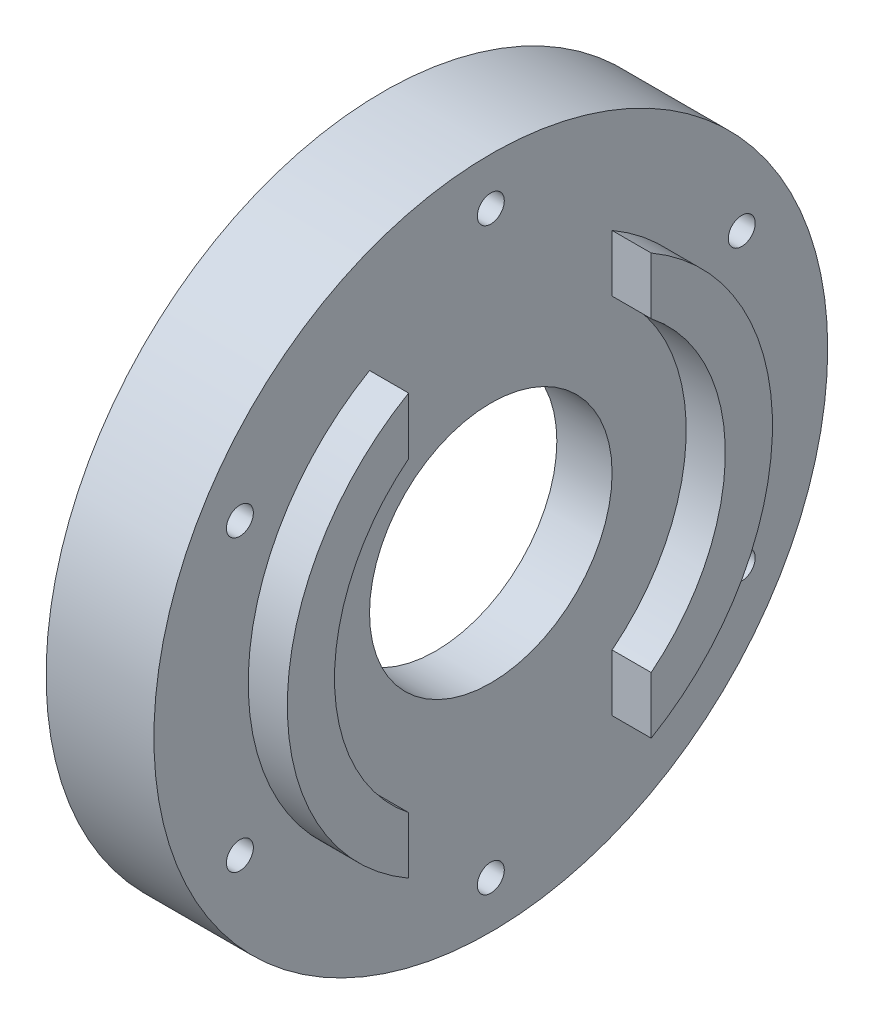
ISO-10303-21;
HEADER;
FILE_DESCRIPTION(('STEP AP214'),'2;1');
FILE_NAME('part.step','',(''),(''),'','','');
FILE_SCHEMA(('AUTOMOTIVE_DESIGN { 1 0 10303 214 1 1 1 1 }'));
ENDSEC;
DATA;
#1=APPLICATION_CONTEXT('core data for automotive mechanical design processes');
#2=APPLICATION_PROTOCOL_DEFINITION('international standard','automotive_design',2000,#1);
#3=PRODUCT_CONTEXT('',#1,'mechanical');
#4=PRODUCT('Part','Part','',(#3));
#5=PRODUCT_RELATED_PRODUCT_CATEGORY('part','',(#4));
#6=PRODUCT_DEFINITION_FORMATION('','',#4);
#7=PRODUCT_DEFINITION_CONTEXT('part definition',#1,'design');
#8=PRODUCT_DEFINITION('design','',#6,#7);
#9=PRODUCT_DEFINITION_SHAPE('','',#8);
#10=(LENGTH_UNIT() NAMED_UNIT(*) SI_UNIT(.MILLI.,.METRE.));
#11=(NAMED_UNIT(*) PLANE_ANGLE_UNIT() SI_UNIT($,.RADIAN.));
#12=(NAMED_UNIT(*) SI_UNIT($,.STERADIAN.) SOLID_ANGLE_UNIT());
#13=UNCERTAINTY_MEASURE_WITH_UNIT(LENGTH_MEASURE(1.E-05),#10,'distance_accuracy_value','');
#14=(GEOMETRIC_REPRESENTATION_CONTEXT(3) GLOBAL_UNCERTAINTY_ASSIGNED_CONTEXT((#13)) GLOBAL_UNIT_ASSIGNED_CONTEXT((#10,
#11,#12)) REPRESENTATION_CONTEXT('',''));
#15=CARTESIAN_POINT('',(0.,0.,0.));
#16=DIRECTION('',(0.,0.,1.));
#17=DIRECTION('',(1.,0.,0.));
#18=AXIS2_PLACEMENT_3D('',#15,#16,#17);
#19=CARTESIAN_POINT('',(-40.,0.,0.));
#20=DIRECTION('',(1.,0.,0.));
#21=DIRECTION('',(0.,0.,-1.));
#22=AXIS2_PLACEMENT_3D('',#19,#20,#21);
#23=CYLINDRICAL_SURFACE('',#22,45.);
#24=CARTESIAN_POINT('',(0.,0.,0.));
#25=DIRECTION('',(1.,0.,0.));
#26=DIRECTION('',(0.,0.,-1.));
#27=AXIS2_PLACEMENT_3D('',#24,#25,#26);
#28=CIRCLE('',#27,45.);
#29=CARTESIAN_POINT('',(0.,0.,-45.));
#30=VERTEX_POINT('',#29);
#31=EDGE_CURVE('E236',#30,#30,#28,.T.);
#32=ORIENTED_EDGE('',*,*,#31,.T.);
#33=EDGE_LOOP('',(#32));
#34=FACE_BOUND('',#33,.T.);
#35=CARTESIAN_POINT('',(-20.5,0.,0.));
#36=DIRECTION('',(-1.,0.,0.));
#37=DIRECTION('',(0.,0.,1.));
#38=AXIS2_PLACEMENT_3D('',#35,#36,#37);
#39=CIRCLE('',#38,45.);
#40=CARTESIAN_POINT('',(-20.5,0.,45.));
#41=VERTEX_POINT('',#40);
#42=EDGE_CURVE('E39',#41,#41,#39,.F.);
#43=ORIENTED_EDGE('',*,*,#42,.F.);
#44=EDGE_LOOP('',(#43));
#45=FACE_BOUND('',#44,.T.);
#46=ADVANCED_FACE('F35',(#34,#45),#23,.F.);
#47=CARTESIAN_POINT('',(14.5,0.,0.));
#48=DIRECTION('',(1.,0.,0.));
#49=DIRECTION('',(0.,0.,-1.));
#50=AXIS2_PLACEMENT_3D('',#47,#48,#49);
#51=PLANE('',#50);
#52=DIRECTION('',(0.,1.,0.));
#53=VECTOR('',#52,1.);
#54=CARTESIAN_POINT('',(14.5,-125.,-45.));
#55=LINE('',#54,#53);
#56=CARTESIAN_POINT('',(14.5,-77.9422863405995,-45.));
#57=VERTEX_POINT('',#56);
#58=CARTESIAN_POINT('',(14.5,-56.8440850045104,-45.));
#59=VERTEX_POINT('',#58);
#60=EDGE_CURVE('E171',#57,#59,#55,.T.);
#61=ORIENTED_EDGE('',*,*,#60,.F.);
#62=CARTESIAN_POINT('',(14.5,0.,0.));
#63=DIRECTION('',(1.,0.,0.));
#64=DIRECTION('',(0.,0.,-1.));
#65=AXIS2_PLACEMENT_3D('',#62,#63,#64);
#66=CIRCLE('',#65,90.);
#67=CARTESIAN_POINT('',(14.5,77.9422863405995,-45.));
#68=VERTEX_POINT('',#67);
#69=EDGE_CURVE('E194',#57,#68,#66,.T.);
#70=ORIENTED_EDGE('',*,*,#69,.T.);
#71=CARTESIAN_POINT('',(14.5,56.8440850045104,-45.));
#72=VERTEX_POINT('',#71);
#73=EDGE_CURVE('E172',#72,#68,#55,.T.);
#74=ORIENTED_EDGE('',*,*,#73,.F.);
#75=CARTESIAN_POINT('',(14.5,0.,0.));
#76=DIRECTION('',(1.,0.,0.));
#77=DIRECTION('',(0.,0.,-1.));
#78=AXIS2_PLACEMENT_3D('',#75,#76,#77);
#79=CIRCLE('',#78,72.5);
#80=EDGE_CURVE('E190',#59,#72,#79,.T.);
#81=ORIENTED_EDGE('',*,*,#80,.F.);
#82=EDGE_LOOP('',(#61,#70,#74,#81));
#83=FACE_BOUND('',#82,.T.);
#84=ADVANCED_FACE('F264',(#83),#51,.T.);
#85=CARTESIAN_POINT('',(14.5,0.,0.));
#86=DIRECTION('',(-1.,0.,0.));
#87=DIRECTION('',(0.,0.,1.));
#88=AXIS2_PLACEMENT_3D('',#85,#86,#87);
#89=CYLINDRICAL_SURFACE('',#88,90.);
#90=ORIENTED_EDGE('',*,*,#69,.F.);
#91=DIRECTION('',(-1.,0.,0.));
#92=VECTOR('',#91,1.);
#93=CARTESIAN_POINT('',(14.5,-77.9422863405995,-45.));
#94=LINE('',#93,#92);
#95=CARTESIAN_POINT('',(0.,-77.9422863405995,-45.));
#96=VERTEX_POINT('',#95);
#97=EDGE_CURVE('E187',#57,#96,#94,.T.);
#98=ORIENTED_EDGE('',*,*,#97,.T.);
#99=CARTESIAN_POINT('',(0.,0.,0.));
#100=DIRECTION('',(1.,0.,0.));
#101=DIRECTION('',(0.,0.,-1.));
#102=AXIS2_PLACEMENT_3D('',#99,#100,#101);
#103=CIRCLE('',#102,90.);
#104=CARTESIAN_POINT('',(0.,77.9422863405995,-45.));
#105=VERTEX_POINT('',#104);
#106=EDGE_CURVE('E199',#96,#105,#103,.T.);
#107=ORIENTED_EDGE('',*,*,#106,.T.);
#108=DIRECTION('',(-1.,0.,0.));
#109=VECTOR('',#108,1.);
#110=CARTESIAN_POINT('',(14.5,77.9422863405995,-45.));
#111=LINE('',#110,#109);
#112=EDGE_CURVE('E184',#105,#68,#111,.F.);
#113=ORIENTED_EDGE('',*,*,#112,.T.);
#114=EDGE_LOOP('',(#90,#98,#107,#113));
#115=FACE_BOUND('',#114,.T.);
#116=ADVANCED_FACE('F276',(#115),#89,.T.);
#117=CARTESIAN_POINT('',(14.5,0.,0.));
#118=DIRECTION('',(-1.,0.,0.));
#119=DIRECTION('',(0.,0.,1.));
#120=AXIS2_PLACEMENT_3D('',#117,#118,#119);
#121=CYLINDRICAL_SURFACE('',#120,72.5);
#122=DIRECTION('',(-1.,0.,0.));
#123=VECTOR('',#122,1.);
#124=CARTESIAN_POINT('',(14.5,-56.8440850045104,-45.));
#125=LINE('',#124,#123);
#126=CARTESIAN_POINT('',(0.,-56.8440850045104,-45.));
#127=VERTEX_POINT('',#126);
#128=EDGE_CURVE('E11',#59,#127,#125,.T.);
#129=ORIENTED_EDGE('',*,*,#128,.F.);
#130=ORIENTED_EDGE('',*,*,#80,.T.);
#131=DIRECTION('',(-1.,0.,0.));
#132=VECTOR('',#131,1.);
#133=CARTESIAN_POINT('',(14.5,56.8440850045104,-45.));
#134=LINE('',#133,#132);
#135=CARTESIAN_POINT('',(0.,56.8440850045104,-45.));
#136=VERTEX_POINT('',#135);
#137=EDGE_CURVE('E44',#136,#72,#134,.F.);
#138=ORIENTED_EDGE('',*,*,#137,.F.);
#139=CARTESIAN_POINT('',(0.,0.,0.));
#140=DIRECTION('',(1.,0.,0.));
#141=DIRECTION('',(0.,0.,-1.));
#142=AXIS2_PLACEMENT_3D('',#139,#140,#141);
#143=CIRCLE('',#142,72.5);
#144=EDGE_CURVE('E245',#136,#127,#143,.F.);
#145=ORIENTED_EDGE('',*,*,#144,.T.);
#146=EDGE_LOOP('',(#129,#130,#138,#145));
#147=FACE_BOUND('',#146,.T.);
#148=ADVANCED_FACE('F267',(#147),#121,.F.);
#149=CARTESIAN_POINT('',(-40.,0.,0.));
#150=DIRECTION('',(1.,0.,0.));
#151=DIRECTION('',(0.,0.,-1.));
#152=AXIS2_PLACEMENT_3D('',#149,#150,#151);
#153=CYLINDRICAL_SURFACE('',#152,125.);
#154=CARTESIAN_POINT('',(-40.,0.,0.));
#155=DIRECTION('',(1.,0.,0.));
#156=DIRECTION('',(0.,0.,-1.));
#157=AXIS2_PLACEMENT_3D('',#154,#155,#156);
#158=CIRCLE('',#157,125.);
#159=CARTESIAN_POINT('',(-40.,0.,-125.));
#160=VERTEX_POINT('',#159);
#161=EDGE_CURVE('E242',#160,#160,#158,.T.);
#162=ORIENTED_EDGE('',*,*,#161,.T.);
#163=EDGE_LOOP('',(#162));
#164=FACE_BOUND('',#163,.T.);
#165=CARTESIAN_POINT('',(0.,0.,0.));
#166=DIRECTION('',(1.,0.,0.));
#167=DIRECTION('',(0.,0.,-1.));
#168=AXIS2_PLACEMENT_3D('',#165,#166,#167);
#169=CIRCLE('',#168,125.);
#170=CARTESIAN_POINT('',(0.,0.,-125.));
#171=VERTEX_POINT('',#170);
#172=EDGE_CURVE('E241',#171,#171,#169,.T.);
#173=ORIENTED_EDGE('',*,*,#172,.F.);
#174=EDGE_LOOP('',(#173));
#175=FACE_BOUND('',#174,.T.);
#176=ADVANCED_FACE('F37',(#164,#175),#153,.T.);
#177=CARTESIAN_POINT('',(-40.,0.,0.));
#178=DIRECTION('',(1.,0.,0.));
#179=DIRECTION('',(0.,0.,-1.));
#180=AXIS2_PLACEMENT_3D('',#177,#178,#179);
#181=PLANE('',#180);
#182=CARTESIAN_POINT('',(-40.,0.,0.));
#183=DIRECTION('',(-1.,0.,0.));
#184=DIRECTION('',(0.,0.,1.));
#185=AXIS2_PLACEMENT_3D('',#182,#183,#184);
#186=CIRCLE('',#185,100.);
#187=CARTESIAN_POINT('',(-40.,0.,100.));
#188=VERTEX_POINT('',#187);
#189=EDGE_CURVE('E161',#188,#188,#186,.T.);
#190=ORIENTED_EDGE('',*,*,#189,.F.);
#191=EDGE_LOOP('',(#190));
#192=FACE_BOUND('',#191,.T.);
#193=CARTESIAN_POINT('',(-40.,-53.7499999999998,-93.0977309068273));
#194=DIRECTION('',(1.,0.,0.));
#195=DIRECTION('',(0.,0.,-1.));
#196=AXIS2_PLACEMENT_3D('',#193,#194,#195);
#197=CIRCLE('',#196,4.99999999999999);
#198=CARTESIAN_POINT('',(-40.,-53.7499999999998,-98.0977309068273));
#199=VERTEX_POINT('',#198);
#200=EDGE_CURVE('E202',#199,#199,#197,.T.);
#201=ORIENTED_EDGE('',*,*,#200,.T.);
#202=EDGE_LOOP('',(#201));
#203=FACE_BOUND('',#202,.T.);
#204=CARTESIAN_POINT('',(-40.,-107.5,0.));
#205=DIRECTION('',(1.,0.,0.));
#206=DIRECTION('',(0.,0.,1.));
#207=AXIS2_PLACEMENT_3D('',#204,#205,#206);
#208=CIRCLE('',#207,5.00000000000001);
#209=CARTESIAN_POINT('',(-40.,-107.5,4.99999999999998));
#210=VERTEX_POINT('',#209);
#211=EDGE_CURVE('E209',#210,#210,#208,.T.);
#212=ORIENTED_EDGE('',*,*,#211,.T.);
#213=EDGE_LOOP('',(#212));
#214=FACE_BOUND('',#213,.T.);
#215=CARTESIAN_POINT('',(-40.,-53.7500000000011,93.0977309068265));
#216=DIRECTION('',(1.,0.,0.));
#217=DIRECTION('',(0.,0.,-1.));
#218=AXIS2_PLACEMENT_3D('',#215,#216,#217);
#219=CIRCLE('',#218,4.99999999999999);
#220=CARTESIAN_POINT('',(-40.,-53.7500000000011,88.0977309068265));
#221=VERTEX_POINT('',#220);
#222=EDGE_CURVE('E215',#221,#221,#219,.T.);
#223=ORIENTED_EDGE('',*,*,#222,.T.);
#224=EDGE_LOOP('',(#223));
#225=FACE_BOUND('',#224,.T.);
#226=CARTESIAN_POINT('',(-40.,53.7500000000011,93.0977309068265));
#227=DIRECTION('',(1.,0.,0.));
#228=DIRECTION('',(0.,0.,1.));
#229=AXIS2_PLACEMENT_3D('',#226,#227,#228);
#230=CIRCLE('',#229,4.99999999999999);
#231=CARTESIAN_POINT('',(-40.,53.7500000000011,98.0977309068265));
#232=VERTEX_POINT('',#231);
#233=EDGE_CURVE('E221',#232,#232,#230,.T.);
#234=ORIENTED_EDGE('',*,*,#233,.T.);
#235=EDGE_LOOP('',(#234));
#236=FACE_BOUND('',#235,.T.);
#237=CARTESIAN_POINT('',(-40.,53.7499999999998,-93.0977309068273));
#238=DIRECTION('',(1.,0.,0.));
#239=DIRECTION('',(0.,0.,1.));
#240=AXIS2_PLACEMENT_3D('',#237,#238,#239);
#241=CIRCLE('',#240,5.00000000000001);
#242=CARTESIAN_POINT('',(-40.,53.7499999999998,-88.0977309068273));
#243=VERTEX_POINT('',#242);
#244=EDGE_CURVE('E227',#243,#243,#241,.T.);
#245=ORIENTED_EDGE('',*,*,#244,.T.);
#246=EDGE_LOOP('',(#245));
#247=FACE_BOUND('',#246,.T.);
#248=CARTESIAN_POINT('',(-40.,107.5,0.));
#249=DIRECTION('',(1.,0.,0.));
#250=DIRECTION('',(0.,0.,-1.));
#251=AXIS2_PLACEMENT_3D('',#248,#249,#250);
#252=CIRCLE('',#251,5.00000000000001);
#253=CARTESIAN_POINT('',(-40.,107.5,-5.00000000000001));
#254=VERTEX_POINT('',#253);
#255=EDGE_CURVE('E233',#254,#254,#252,.T.);
#256=ORIENTED_EDGE('',*,*,#255,.T.);
#257=EDGE_LOOP('',(#256));
#258=FACE_BOUND('',#257,.T.);
#259=ORIENTED_EDGE('',*,*,#161,.F.);
#260=EDGE_LOOP('',(#259));
#261=FACE_BOUND('',#260,.T.);
#262=ADVANCED_FACE('F301',(#192,#203,#214,#225,#236,#247,#258,#261),#181,.F.);
#263=CARTESIAN_POINT('',(0.,0.,0.));
#264=DIRECTION('',(1.,0.,0.));
#265=DIRECTION('',(0.,0.,-1.));
#266=AXIS2_PLACEMENT_3D('',#263,#264,#265);
#267=PLANE('',#266);
#268=ORIENTED_EDGE('',*,*,#31,.F.);
#269=EDGE_LOOP('',(#268));
#270=FACE_BOUND('',#269,.T.);
#271=DIRECTION('',(0.,1.,0.));
#272=VECTOR('',#271,1.);
#273=CARTESIAN_POINT('',(0.,-125.,-45.));
#274=LINE('',#273,#272);
#275=EDGE_CURVE('E170',#96,#127,#274,.T.);
#276=ORIENTED_EDGE('',*,*,#275,.T.);
#277=ORIENTED_EDGE('',*,*,#144,.F.);
#278=EDGE_CURVE('E167',#136,#105,#274,.T.);
#279=ORIENTED_EDGE('',*,*,#278,.T.);
#280=ORIENTED_EDGE('',*,*,#106,.F.);
#281=EDGE_LOOP('',(#276,#277,#279,#280));
#282=FACE_BOUND('',#281,.T.);
#283=DIRECTION('',(0.,1.,0.));
#284=VECTOR('',#283,1.);
#285=CARTESIAN_POINT('',(0.,-125.,45.));
#286=LINE('',#285,#284);
#287=CARTESIAN_POINT('',(0.,56.8440850045104,45.));
#288=VERTEX_POINT('',#287);
#289=CARTESIAN_POINT('',(0.,77.9422863405995,45.));
#290=VERTEX_POINT('',#289);
#291=EDGE_CURVE('E176',#288,#290,#286,.T.);
#292=ORIENTED_EDGE('',*,*,#291,.F.);
#293=CARTESIAN_POINT('',(0.,-56.8440850045104,45.));
#294=VERTEX_POINT('',#293);
#295=EDGE_CURVE('E250',#294,#288,#143,.F.);
#296=ORIENTED_EDGE('',*,*,#295,.F.);
#297=CARTESIAN_POINT('',(0.,-77.9422863405995,45.));
#298=VERTEX_POINT('',#297);
#299=EDGE_CURVE('E51',#298,#294,#286,.T.);
#300=ORIENTED_EDGE('',*,*,#299,.F.);
#301=EDGE_CURVE('E198',#290,#298,#103,.T.);
#302=ORIENTED_EDGE('',*,*,#301,.F.);
#303=EDGE_LOOP('',(#292,#296,#300,#302));
#304=FACE_BOUND('',#303,.T.);
#305=ORIENTED_EDGE('',*,*,#172,.T.);
#306=EDGE_LOOP('',(#305));
#307=FACE_BOUND('',#306,.T.);
#308=CARTESIAN_POINT('',(0.,-53.7500000000011,93.0977309068265));
#309=DIRECTION('',(1.,0.,0.));
#310=DIRECTION('',(0.,0.,-1.));
#311=AXIS2_PLACEMENT_3D('',#308,#309,#310);
#312=CIRCLE('',#311,4.99999999999999);
#313=CARTESIAN_POINT('',(0.,-53.7500000000011,88.0977309068265));
#314=VERTEX_POINT('',#313);
#315=EDGE_CURVE('E212',#314,#314,#312,.T.);
#316=ORIENTED_EDGE('',*,*,#315,.F.);
#317=EDGE_LOOP('',(#316));
#318=FACE_BOUND('',#317,.T.);
#319=CARTESIAN_POINT('',(0.,53.7500000000011,93.0977309068265));
#320=DIRECTION('',(1.,0.,0.));
#321=DIRECTION('',(0.,0.,1.));
#322=AXIS2_PLACEMENT_3D('',#319,#320,#321);
#323=CIRCLE('',#322,4.99999999999999);
#324=CARTESIAN_POINT('',(0.,53.7500000000011,98.0977309068265));
#325=VERTEX_POINT('',#324);
#326=EDGE_CURVE('E218',#325,#325,#323,.T.);
#327=ORIENTED_EDGE('',*,*,#326,.F.);
#328=EDGE_LOOP('',(#327));
#329=FACE_BOUND('',#328,.T.);
#330=CARTESIAN_POINT('',(0.,-107.5,0.));
#331=DIRECTION('',(1.,0.,0.));
#332=DIRECTION('',(0.,0.,1.));
#333=AXIS2_PLACEMENT_3D('',#330,#331,#332);
#334=CIRCLE('',#333,5.00000000000001);
#335=CARTESIAN_POINT('',(0.,-107.5,4.99999999999998));
#336=VERTEX_POINT('',#335);
#337=EDGE_CURVE('E205',#336,#336,#334,.T.);
#338=ORIENTED_EDGE('',*,*,#337,.F.);
#339=EDGE_LOOP('',(#338));
#340=FACE_BOUND('',#339,.T.);
#341=CARTESIAN_POINT('',(0.,107.5,0.));
#342=DIRECTION('',(1.,0.,0.));
#343=DIRECTION('',(0.,0.,-1.));
#344=AXIS2_PLACEMENT_3D('',#341,#342,#343);
#345=CIRCLE('',#344,5.00000000000001);
#346=CARTESIAN_POINT('',(0.,107.5,-5.00000000000001));
#347=VERTEX_POINT('',#346);
#348=EDGE_CURVE('E230',#347,#347,#345,.T.);
#349=ORIENTED_EDGE('',*,*,#348,.F.);
#350=EDGE_LOOP('',(#349));
#351=FACE_BOUND('',#350,.T.);
#352=CARTESIAN_POINT('',(0.,53.7499999999998,-93.0977309068273));
#353=DIRECTION('',(1.,0.,0.));
#354=DIRECTION('',(0.,0.,1.));
#355=AXIS2_PLACEMENT_3D('',#352,#353,#354);
#356=CIRCLE('',#355,5.00000000000001);
#357=CARTESIAN_POINT('',(0.,53.7499999999998,-88.0977309068273));
#358=VERTEX_POINT('',#357);
#359=EDGE_CURVE('E224',#358,#358,#356,.T.);
#360=ORIENTED_EDGE('',*,*,#359,.F.);
#361=EDGE_LOOP('',(#360));
#362=FACE_BOUND('',#361,.T.);
#363=CARTESIAN_POINT('',(0.,-53.7499999999998,-93.0977309068273));
#364=DIRECTION('',(1.,0.,0.));
#365=DIRECTION('',(0.,0.,-1.));
#366=AXIS2_PLACEMENT_3D('',#363,#364,#365);
#367=CIRCLE('',#366,4.99999999999999);
#368=CARTESIAN_POINT('',(0.,-53.7499999999998,-98.0977309068273));
#369=VERTEX_POINT('',#368);
#370=EDGE_CURVE('E206',#369,#369,#367,.T.);
#371=ORIENTED_EDGE('',*,*,#370,.F.);
#372=EDGE_LOOP('',(#371));
#373=FACE_BOUND('',#372,.T.);
#374=ADVANCED_FACE('F273',(#270,#282,#304,#307,#318,#329,#340,#351,#362,#373),#267,.T.);
#375=CARTESIAN_POINT('',(-40.,107.5,0.));
#376=DIRECTION('',(1.,0.,0.));
#377=DIRECTION('',(0.,0.,-1.));
#378=AXIS2_PLACEMENT_3D('',#375,#376,#377);
#379=CYLINDRICAL_SURFACE('',#378,5.00000000000001);
#380=ORIENTED_EDGE('',*,*,#255,.F.);
#381=EDGE_LOOP('',(#380));
#382=FACE_BOUND('',#381,.T.);
#383=ORIENTED_EDGE('',*,*,#348,.T.);
#384=EDGE_LOOP('',(#383));
#385=FACE_BOUND('',#384,.T.);
#386=ADVANCED_FACE('F299',(#382,#385),#379,.F.);
#387=CARTESIAN_POINT('',(-40.,53.7499999999998,-93.0977309068273));
#388=DIRECTION('',(1.,0.,0.));
#389=DIRECTION('',(0.,0.,-1.));
#390=AXIS2_PLACEMENT_3D('',#387,#388,#389);
#391=CYLINDRICAL_SURFACE('',#390,5.00000000000001);
#392=ORIENTED_EDGE('',*,*,#244,.F.);
#393=EDGE_LOOP('',(#392));
#394=FACE_BOUND('',#393,.T.);
#395=ORIENTED_EDGE('',*,*,#359,.T.);
#396=EDGE_LOOP('',(#395));
#397=FACE_BOUND('',#396,.T.);
#398=ADVANCED_FACE('F309',(#394,#397),#391,.F.);
#399=CARTESIAN_POINT('',(-40.,53.7500000000011,93.0977309068265));
#400=DIRECTION('',(1.,0.,0.));
#401=DIRECTION('',(0.,0.,-1.));
#402=AXIS2_PLACEMENT_3D('',#399,#400,#401);
#403=CYLINDRICAL_SURFACE('',#402,4.99999999999999);
#404=ORIENTED_EDGE('',*,*,#233,.F.);
#405=EDGE_LOOP('',(#404));
#406=FACE_BOUND('',#405,.T.);
#407=ORIENTED_EDGE('',*,*,#326,.T.);
#408=EDGE_LOOP('',(#407));
#409=FACE_BOUND('',#408,.T.);
#410=ADVANCED_FACE('F315',(#406,#409),#403,.F.);
#411=CARTESIAN_POINT('',(-40.,-53.7500000000011,93.0977309068265));
#412=DIRECTION('',(1.,0.,0.));
#413=DIRECTION('',(0.,0.,-1.));
#414=AXIS2_PLACEMENT_3D('',#411,#412,#413);
#415=CYLINDRICAL_SURFACE('',#414,4.99999999999999);
#416=ORIENTED_EDGE('',*,*,#222,.F.);
#417=EDGE_LOOP('',(#416));
#418=FACE_BOUND('',#417,.T.);
#419=ORIENTED_EDGE('',*,*,#315,.T.);
#420=EDGE_LOOP('',(#419));
#421=FACE_BOUND('',#420,.T.);
#422=ADVANCED_FACE('F335',(#418,#421),#415,.F.);
#423=CARTESIAN_POINT('',(-40.,-107.5,0.));
#424=DIRECTION('',(1.,0.,0.));
#425=DIRECTION('',(0.,0.,-1.));
#426=AXIS2_PLACEMENT_3D('',#423,#424,#425);
#427=CYLINDRICAL_SURFACE('',#426,5.00000000000001);
#428=ORIENTED_EDGE('',*,*,#211,.F.);
#429=EDGE_LOOP('',(#428));
#430=FACE_BOUND('',#429,.T.);
#431=ORIENTED_EDGE('',*,*,#337,.T.);
#432=EDGE_LOOP('',(#431));
#433=FACE_BOUND('',#432,.T.);
#434=ADVANCED_FACE('F328',(#430,#433),#427,.F.);
#435=CARTESIAN_POINT('',(-40.,-53.7499999999998,-93.0977309068273));
#436=DIRECTION('',(1.,0.,0.));
#437=DIRECTION('',(0.,0.,-1.));
#438=AXIS2_PLACEMENT_3D('',#435,#436,#437);
#439=CYLINDRICAL_SURFACE('',#438,4.99999999999999);
#440=ORIENTED_EDGE('',*,*,#200,.F.);
#441=EDGE_LOOP('',(#440));
#442=FACE_BOUND('',#441,.T.);
#443=ORIENTED_EDGE('',*,*,#370,.T.);
#444=EDGE_LOOP('',(#443));
#445=FACE_BOUND('',#444,.T.);
#446=ADVANCED_FACE('F326',(#442,#445),#439,.F.);
#447=DIRECTION('',(0.,1.,0.));
#448=VECTOR('',#447,1.);
#449=CARTESIAN_POINT('',(14.5,-125.,45.));
#450=LINE('',#449,#448);
#451=CARTESIAN_POINT('',(14.5,56.8440850045104,45.));
#452=VERTEX_POINT('',#451);
#453=CARTESIAN_POINT('',(14.5,77.9422863405995,45.));
#454=VERTEX_POINT('',#453);
#455=EDGE_CURVE('E59',#452,#454,#450,.T.);
#456=ORIENTED_EDGE('',*,*,#455,.T.);
#457=CARTESIAN_POINT('',(14.5,-77.9422863405995,45.));
#458=VERTEX_POINT('',#457);
#459=EDGE_CURVE('E197',#454,#458,#66,.T.);
#460=ORIENTED_EDGE('',*,*,#459,.T.);
#461=CARTESIAN_POINT('',(14.5,-56.8440850045104,45.));
#462=VERTEX_POINT('',#461);
#463=EDGE_CURVE('E174',#458,#462,#450,.T.);
#464=ORIENTED_EDGE('',*,*,#463,.T.);
#465=EDGE_CURVE('E193',#452,#462,#79,.T.);
#466=ORIENTED_EDGE('',*,*,#465,.F.);
#467=EDGE_LOOP('',(#456,#460,#464,#466));
#468=FACE_BOUND('',#467,.T.);
#469=ADVANCED_FACE('F287',(#468),#51,.T.);
#470=ORIENTED_EDGE('',*,*,#459,.F.);
#471=DIRECTION('',(-1.,0.,0.));
#472=VECTOR('',#471,1.);
#473=CARTESIAN_POINT('',(14.5,77.9422863405995,45.));
#474=LINE('',#473,#472);
#475=EDGE_CURVE('E181',#454,#290,#474,.T.);
#476=ORIENTED_EDGE('',*,*,#475,.T.);
#477=ORIENTED_EDGE('',*,*,#301,.T.);
#478=DIRECTION('',(-1.,0.,0.));
#479=VECTOR('',#478,1.);
#480=CARTESIAN_POINT('',(14.5,-77.9422863405995,45.));
#481=LINE('',#480,#479);
#482=EDGE_CURVE('E178',#298,#458,#481,.F.);
#483=ORIENTED_EDGE('',*,*,#482,.T.);
#484=EDGE_LOOP('',(#470,#476,#477,#483));
#485=FACE_BOUND('',#484,.T.);
#486=ADVANCED_FACE('F279',(#485),#89,.T.);
#487=DIRECTION('',(-1.,0.,0.));
#488=VECTOR('',#487,1.);
#489=CARTESIAN_POINT('',(14.5,56.8440850045104,45.));
#490=LINE('',#489,#488);
#491=EDGE_CURVE('E253',#452,#288,#490,.T.);
#492=ORIENTED_EDGE('',*,*,#491,.F.);
#493=ORIENTED_EDGE('',*,*,#465,.T.);
#494=DIRECTION('',(-1.,0.,0.));
#495=VECTOR('',#494,1.);
#496=CARTESIAN_POINT('',(14.5,-56.8440850045104,45.));
#497=LINE('',#496,#495);
#498=EDGE_CURVE('E251',#294,#462,#497,.F.);
#499=ORIENTED_EDGE('',*,*,#498,.F.);
#500=ORIENTED_EDGE('',*,*,#295,.T.);
#501=EDGE_LOOP('',(#492,#493,#499,#500));
#502=FACE_BOUND('',#501,.T.);
#503=ADVANCED_FACE('F285',(#502),#121,.F.);
#504=CARTESIAN_POINT('',(0.,-125.,45.));
#505=DIRECTION('',(0.,0.,1.));
#506=DIRECTION('',(1.,0.,0.));
#507=AXIS2_PLACEMENT_3D('',#504,#505,#506);
#508=PLANE('',#507);
#509=ORIENTED_EDGE('',*,*,#299,.T.);
#510=ORIENTED_EDGE('',*,*,#498,.T.);
#511=ORIENTED_EDGE('',*,*,#463,.F.);
#512=ORIENTED_EDGE('',*,*,#482,.F.);
#513=EDGE_LOOP('',(#509,#510,#511,#512));
#514=FACE_BOUND('',#513,.T.);
#515=ADVANCED_FACE('F523',(#514),#508,.F.);
#516=CARTESIAN_POINT('',(0.,-125.,-45.));
#517=DIRECTION('',(0.,0.,-1.));
#518=DIRECTION('',(-1.,0.,0.));
#519=AXIS2_PLACEMENT_3D('',#516,#517,#518);
#520=PLANE('',#519);
#521=ORIENTED_EDGE('',*,*,#60,.T.);
#522=ORIENTED_EDGE('',*,*,#128,.T.);
#523=ORIENTED_EDGE('',*,*,#275,.F.);
#524=ORIENTED_EDGE('',*,*,#97,.F.);
#525=EDGE_LOOP('',(#521,#522,#523,#524));
#526=FACE_BOUND('',#525,.T.);
#527=ADVANCED_FACE('F270',(#526),#520,.F.);
#528=ORIENTED_EDGE('',*,*,#278,.F.);
#529=ORIENTED_EDGE('',*,*,#137,.T.);
#530=ORIENTED_EDGE('',*,*,#73,.T.);
#531=ORIENTED_EDGE('',*,*,#112,.F.);
#532=EDGE_LOOP('',(#528,#529,#530,#531));
#533=FACE_BOUND('',#532,.T.);
#534=ADVANCED_FACE('F258',(#533),#520,.F.);
#535=ORIENTED_EDGE('',*,*,#455,.F.);
#536=ORIENTED_EDGE('',*,*,#491,.T.);
#537=ORIENTED_EDGE('',*,*,#291,.T.);
#538=ORIENTED_EDGE('',*,*,#475,.F.);
#539=EDGE_LOOP('',(#535,#536,#537,#538));
#540=FACE_BOUND('',#539,.T.);
#541=ADVANCED_FACE('F403',(#540),#508,.F.);
#542=CARTESIAN_POINT('',(-20.5,0.,0.));
#543=DIRECTION('',(-1.,0.,0.));
#544=DIRECTION('',(0.,0.,1.));
#545=AXIS2_PLACEMENT_3D('',#542,#543,#544);
#546=PLANE('',#545);
#547=CARTESIAN_POINT('',(-20.5,90.,0.));
#548=DIRECTION('',(-1.,0.,0.));
#549=DIRECTION('',(0.,0.,1.));
#550=AXIS2_PLACEMENT_3D('',#547,#548,#549);
#551=CIRCLE('',#550,4.);
#552=CARTESIAN_POINT('',(-20.5,90.,4.));
#553=VERTEX_POINT('',#552);
#554=EDGE_CURVE('E127',#553,#553,#551,.T.);
#555=ORIENTED_EDGE('',*,*,#554,.F.);
#556=EDGE_LOOP('',(#555));
#557=FACE_BOUND('',#556,.T.);
#558=CARTESIAN_POINT('',(-20.5,44.9999999999998,77.9422863405996));
#559=DIRECTION('',(-1.,0.,0.));
#560=DIRECTION('',(0.,0.,1.));
#561=AXIS2_PLACEMENT_3D('',#558,#559,#560);
#562=CIRCLE('',#561,4.);
#563=CARTESIAN_POINT('',(-20.5,44.9999999999998,81.9422863405996));
#564=VERTEX_POINT('',#563);
#565=EDGE_CURVE('E126',#564,#564,#562,.T.);
#566=ORIENTED_EDGE('',*,*,#565,.F.);
#567=EDGE_LOOP('',(#566));
#568=FACE_BOUND('',#567,.T.);
#569=CARTESIAN_POINT('',(-20.5,-44.9999999999998,77.9422863405996));
#570=DIRECTION('',(-1.,0.,0.));
#571=DIRECTION('',(0.,0.,1.));
#572=AXIS2_PLACEMENT_3D('',#569,#570,#571);
#573=CIRCLE('',#572,4.);
#574=CARTESIAN_POINT('',(-20.5,-44.9999999999998,81.9422863405996));
#575=VERTEX_POINT('',#574);
#576=EDGE_CURVE('E137',#575,#575,#573,.T.);
#577=ORIENTED_EDGE('',*,*,#576,.F.);
#578=EDGE_LOOP('',(#577));
#579=FACE_BOUND('',#578,.T.);
#580=CARTESIAN_POINT('',(-20.5,-90.,0.));
#581=DIRECTION('',(-1.,0.,0.));
#582=DIRECTION('',(0.,0.,1.));
#583=AXIS2_PLACEMENT_3D('',#580,#581,#582);
#584=CIRCLE('',#583,4.);
#585=CARTESIAN_POINT('',(-20.5,-90.,4.));
#586=VERTEX_POINT('',#585);
#587=EDGE_CURVE('E143',#586,#586,#584,.T.);
#588=ORIENTED_EDGE('',*,*,#587,.F.);
#589=EDGE_LOOP('',(#588));
#590=FACE_BOUND('',#589,.T.);
#591=CARTESIAN_POINT('',(-20.5,-44.9999999999998,-77.9422863405996));
#592=DIRECTION('',(-1.,0.,0.));
#593=DIRECTION('',(0.,0.,1.));
#594=AXIS2_PLACEMENT_3D('',#591,#592,#593);
#595=CIRCLE('',#594,4.);
#596=CARTESIAN_POINT('',(-20.5,-44.9999999999998,-73.9422863405996));
#597=VERTEX_POINT('',#596);
#598=EDGE_CURVE('E149',#597,#597,#595,.T.);
#599=ORIENTED_EDGE('',*,*,#598,.F.);
#600=EDGE_LOOP('',(#599));
#601=FACE_BOUND('',#600,.T.);
#602=CARTESIAN_POINT('',(-20.5,44.9999999999998,-77.9422863405996));
#603=DIRECTION('',(-1.,0.,0.));
#604=DIRECTION('',(0.,0.,1.));
#605=AXIS2_PLACEMENT_3D('',#602,#603,#604);
#606=CIRCLE('',#605,4.);
#607=CARTESIAN_POINT('',(-20.5,44.9999999999998,-73.9422863405996));
#608=VERTEX_POINT('',#607);
#609=EDGE_CURVE('E155',#608,#608,#606,.T.);
#610=ORIENTED_EDGE('',*,*,#609,.F.);
#611=EDGE_LOOP('',(#610));
#612=FACE_BOUND('',#611,.T.);
#613=CARTESIAN_POINT('',(-20.5,0.,0.));
#614=DIRECTION('',(-1.,0.,0.));
#615=DIRECTION('',(0.,0.,1.));
#616=AXIS2_PLACEMENT_3D('',#613,#614,#615);
#617=CIRCLE('',#616,100.);
#618=CARTESIAN_POINT('',(-20.5,0.,100.));
#619=VERTEX_POINT('',#618);
#620=EDGE_CURVE('E162',#619,#619,#617,.T.);
#621=ORIENTED_EDGE('',*,*,#620,.T.);
#622=EDGE_LOOP('',(#621));
#623=FACE_BOUND('',#622,.T.);
#624=ORIENTED_EDGE('',*,*,#42,.T.);
#625=EDGE_LOOP('',(#624));
#626=FACE_BOUND('',#625,.T.);
#627=ADVANCED_FACE('F391',(#557,#568,#579,#590,#601,#612,#623,#626),#546,.T.);
#628=CARTESIAN_POINT('',(-20.5,0.,0.));
#629=DIRECTION('',(-1.,0.,0.));
#630=DIRECTION('',(0.,0.,1.));
#631=AXIS2_PLACEMENT_3D('',#628,#629,#630);
#632=CYLINDRICAL_SURFACE('',#631,100.);
#633=ORIENTED_EDGE('',*,*,#620,.F.);
#634=EDGE_LOOP('',(#633));
#635=FACE_BOUND('',#634,.T.);
#636=ORIENTED_EDGE('',*,*,#189,.T.);
#637=EDGE_LOOP('',(#636));
#638=FACE_BOUND('',#637,.T.);
#639=ADVANCED_FACE('F385',(#635,#638),#632,.F.);
#640=CARTESIAN_POINT('',(-10.5,44.9999999999998,-77.9422863405996));
#641=DIRECTION('',(-1.,0.,0.));
#642=DIRECTION('',(0.,0.,1.));
#643=AXIS2_PLACEMENT_3D('',#640,#641,#642);
#644=CONICAL_SURFACE('',#643,4.,1.02974425867665);
#645=CARTESIAN_POINT('',(-8.09655752388976,44.9999999999998,-77.9422863405996));
#646=VERTEX_POINT('',#645);
#647=VERTEX_LOOP('',#646);
#648=FACE_BOUND('',#647,.T.);
#649=CARTESIAN_POINT('',(-10.5,44.9999999999998,-77.9422863405996));
#650=DIRECTION('',(-1.,0.,0.));
#651=DIRECTION('',(0.,0.,1.));
#652=AXIS2_PLACEMENT_3D('',#649,#650,#651);
#653=CIRCLE('',#652,4.);
#654=CARTESIAN_POINT('',(-10.5,44.9999999999998,-73.9422863405996));
#655=VERTEX_POINT('',#654);
#656=EDGE_CURVE('E158',#655,#655,#653,.T.);
#657=ORIENTED_EDGE('',*,*,#656,.T.);
#658=EDGE_LOOP('',(#657));
#659=FACE_BOUND('',#658,.T.);
#660=ADVANCED_FACE('F390',(#648,#659),#644,.F.);
#661=CARTESIAN_POINT('',(-20.5,44.9999999999998,-77.9422863405996));
#662=DIRECTION('',(-1.,0.,0.));
#663=DIRECTION('',(0.,0.,1.));
#664=AXIS2_PLACEMENT_3D('',#661,#662,#663);
#665=CYLINDRICAL_SURFACE('',#664,4.);
#666=ORIENTED_EDGE('',*,*,#656,.F.);
#667=EDGE_LOOP('',(#666));
#668=FACE_BOUND('',#667,.T.);
#669=ORIENTED_EDGE('',*,*,#609,.T.);
#670=EDGE_LOOP('',(#669));
#671=FACE_BOUND('',#670,.T.);
#672=ADVANCED_FACE('F412',(#668,#671),#665,.F.);
#673=CARTESIAN_POINT('',(-10.5,-44.9999999999998,-77.9422863405996));
#674=DIRECTION('',(-1.,0.,0.));
#675=DIRECTION('',(0.,0.,1.));
#676=AXIS2_PLACEMENT_3D('',#673,#674,#675);
#677=CONICAL_SURFACE('',#676,4.,1.02974425867665);
#678=CARTESIAN_POINT('',(-8.09655752388976,-44.9999999999998,-77.9422863405996));
#679=VERTEX_POINT('',#678);
#680=VERTEX_LOOP('',#679);
#681=FACE_BOUND('',#680,.T.);
#682=CARTESIAN_POINT('',(-10.5,-44.9999999999998,-77.9422863405996));
#683=DIRECTION('',(-1.,0.,0.));
#684=DIRECTION('',(0.,0.,1.));
#685=AXIS2_PLACEMENT_3D('',#682,#683,#684);
#686=CIRCLE('',#685,4.);
#687=CARTESIAN_POINT('',(-10.5,-44.9999999999998,-73.9422863405996));
#688=VERTEX_POINT('',#687);
#689=EDGE_CURVE('E152',#688,#688,#686,.T.);
#690=ORIENTED_EDGE('',*,*,#689,.T.);
#691=EDGE_LOOP('',(#690));
#692=FACE_BOUND('',#691,.T.);
#693=ADVANCED_FACE('F422',(#681,#692),#677,.F.);
#694=CARTESIAN_POINT('',(-20.5,-44.9999999999998,-77.9422863405996));
#695=DIRECTION('',(-1.,0.,0.));
#696=DIRECTION('',(0.,0.,1.));
#697=AXIS2_PLACEMENT_3D('',#694,#695,#696);
#698=CYLINDRICAL_SURFACE('',#697,4.);
#699=ORIENTED_EDGE('',*,*,#689,.F.);
#700=EDGE_LOOP('',(#699));
#701=FACE_BOUND('',#700,.T.);
#702=ORIENTED_EDGE('',*,*,#598,.T.);
#703=EDGE_LOOP('',(#702));
#704=FACE_BOUND('',#703,.T.);
#705=ADVANCED_FACE('F432',(#701,#704),#698,.F.);
#706=CARTESIAN_POINT('',(-10.5,-90.,0.));
#707=DIRECTION('',(-1.,0.,0.));
#708=DIRECTION('',(0.,0.,1.));
#709=AXIS2_PLACEMENT_3D('',#706,#707,#708);
#710=CONICAL_SURFACE('',#709,4.,1.02974425867665);
#711=CARTESIAN_POINT('',(-8.09655752388976,-90.,0.));
#712=VERTEX_POINT('',#711);
#713=VERTEX_LOOP('',#712);
#714=FACE_BOUND('',#713,.T.);
#715=CARTESIAN_POINT('',(-10.5,-90.,0.));
#716=DIRECTION('',(-1.,0.,0.));
#717=DIRECTION('',(0.,0.,1.));
#718=AXIS2_PLACEMENT_3D('',#715,#716,#717);
#719=CIRCLE('',#718,4.);
#720=CARTESIAN_POINT('',(-10.5,-90.,4.));
#721=VERTEX_POINT('',#720);
#722=EDGE_CURVE('E146',#721,#721,#719,.T.);
#723=ORIENTED_EDGE('',*,*,#722,.T.);
#724=EDGE_LOOP('',(#723));
#725=FACE_BOUND('',#724,.T.);
#726=ADVANCED_FACE('F442',(#714,#725),#710,.F.);
#727=CARTESIAN_POINT('',(-20.5,-90.,0.));
#728=DIRECTION('',(-1.,0.,0.));
#729=DIRECTION('',(0.,0.,1.));
#730=AXIS2_PLACEMENT_3D('',#727,#728,#729);
#731=CYLINDRICAL_SURFACE('',#730,4.);
#732=ORIENTED_EDGE('',*,*,#722,.F.);
#733=EDGE_LOOP('',(#732));
#734=FACE_BOUND('',#733,.T.);
#735=ORIENTED_EDGE('',*,*,#587,.T.);
#736=EDGE_LOOP('',(#735));
#737=FACE_BOUND('',#736,.T.);
#738=ADVANCED_FACE('F452',(#734,#737),#731,.F.);
#739=CARTESIAN_POINT('',(-10.5,-44.9999999999998,77.9422863405996));
#740=DIRECTION('',(-1.,0.,0.));
#741=DIRECTION('',(0.,0.,1.));
#742=AXIS2_PLACEMENT_3D('',#739,#740,#741);
#743=CONICAL_SURFACE('',#742,4.,1.02974425867665);
#744=CARTESIAN_POINT('',(-8.09655752388976,-44.9999999999998,77.9422863405996));
#745=VERTEX_POINT('',#744);
#746=VERTEX_LOOP('',#745);
#747=FACE_BOUND('',#746,.T.);
#748=CARTESIAN_POINT('',(-10.5,-44.9999999999998,77.9422863405996));
#749=DIRECTION('',(-1.,0.,0.));
#750=DIRECTION('',(0.,0.,1.));
#751=AXIS2_PLACEMENT_3D('',#748,#749,#750);
#752=CIRCLE('',#751,4.);
#753=CARTESIAN_POINT('',(-10.5,-44.9999999999998,81.9422863405996));
#754=VERTEX_POINT('',#753);
#755=EDGE_CURVE('E140',#754,#754,#752,.T.);
#756=ORIENTED_EDGE('',*,*,#755,.T.);
#757=EDGE_LOOP('',(#756));
#758=FACE_BOUND('',#757,.T.);
#759=ADVANCED_FACE('F462',(#747,#758),#743,.F.);
#760=CARTESIAN_POINT('',(-20.5,-44.9999999999998,77.9422863405996));
#761=DIRECTION('',(-1.,0.,0.));
#762=DIRECTION('',(0.,0.,1.));
#763=AXIS2_PLACEMENT_3D('',#760,#761,#762);
#764=CYLINDRICAL_SURFACE('',#763,4.);
#765=ORIENTED_EDGE('',*,*,#755,.F.);
#766=EDGE_LOOP('',(#765));
#767=FACE_BOUND('',#766,.T.);
#768=ORIENTED_EDGE('',*,*,#576,.T.);
#769=EDGE_LOOP('',(#768));
#770=FACE_BOUND('',#769,.T.);
#771=ADVANCED_FACE('F472',(#767,#770),#764,.F.);
#772=CARTESIAN_POINT('',(-10.5,44.9999999999998,77.9422863405996));
#773=DIRECTION('',(-1.,0.,0.));
#774=DIRECTION('',(0.,0.,1.));
#775=AXIS2_PLACEMENT_3D('',#772,#773,#774);
#776=CONICAL_SURFACE('',#775,4.,1.02974425867665);
#777=CARTESIAN_POINT('',(-8.09655752388976,44.9999999999998,77.9422863405996));
#778=VERTEX_POINT('',#777);
#779=VERTEX_LOOP('',#778);
#780=FACE_BOUND('',#779,.T.);
#781=CARTESIAN_POINT('',(-10.5,44.9999999999998,77.9422863405996));
#782=DIRECTION('',(-1.,0.,0.));
#783=DIRECTION('',(0.,0.,1.));
#784=AXIS2_PLACEMENT_3D('',#781,#782,#783);
#785=CIRCLE('',#784,4.);
#786=CARTESIAN_POINT('',(-10.5,44.9999999999998,81.9422863405996));
#787=VERTEX_POINT('',#786);
#788=EDGE_CURVE('E130',#787,#787,#785,.T.);
#789=ORIENTED_EDGE('',*,*,#788,.T.);
#790=EDGE_LOOP('',(#789));
#791=FACE_BOUND('',#790,.T.);
#792=ADVANCED_FACE('F482',(#780,#791),#776,.F.);
#793=CARTESIAN_POINT('',(-20.5,44.9999999999998,77.9422863405996));
#794=DIRECTION('',(-1.,0.,0.));
#795=DIRECTION('',(0.,0.,1.));
#796=AXIS2_PLACEMENT_3D('',#793,#794,#795);
#797=CYLINDRICAL_SURFACE('',#796,4.);
#798=ORIENTED_EDGE('',*,*,#788,.F.);
#799=EDGE_LOOP('',(#798));
#800=FACE_BOUND('',#799,.T.);
#801=ORIENTED_EDGE('',*,*,#565,.T.);
#802=EDGE_LOOP('',(#801));
#803=FACE_BOUND('',#802,.T.);
#804=ADVANCED_FACE('F120',(#800,#803),#797,.F.);
#805=CARTESIAN_POINT('',(-10.5,90.,0.));
#806=DIRECTION('',(-1.,0.,0.));
#807=DIRECTION('',(0.,0.,1.));
#808=AXIS2_PLACEMENT_3D('',#805,#806,#807);
#809=CONICAL_SURFACE('',#808,4.,1.02974425867665);
#810=CARTESIAN_POINT('',(-8.09655752388976,90.,0.));
#811=VERTEX_POINT('',#810);
#812=VERTEX_LOOP('',#811);
#813=FACE_BOUND('',#812,.T.);
#814=CARTESIAN_POINT('',(-10.5,90.,0.));
#815=DIRECTION('',(-1.,0.,0.));
#816=DIRECTION('',(0.,0.,1.));
#817=AXIS2_PLACEMENT_3D('',#814,#815,#816);
#818=CIRCLE('',#817,4.);
#819=CARTESIAN_POINT('',(-10.5,90.,4.));
#820=VERTEX_POINT('',#819);
#821=EDGE_CURVE('E124',#820,#820,#818,.T.);
#822=ORIENTED_EDGE('',*,*,#821,.T.);
#823=EDGE_LOOP('',(#822));
#824=FACE_BOUND('',#823,.T.);
#825=ADVANCED_FACE('F116',(#813,#824),#809,.F.);
#826=CARTESIAN_POINT('',(-20.5,90.,0.));
#827=DIRECTION('',(-1.,0.,0.));
#828=DIRECTION('',(0.,0.,1.));
#829=AXIS2_PLACEMENT_3D('',#826,#827,#828);
#830=CYLINDRICAL_SURFACE('',#829,4.);
#831=ORIENTED_EDGE('',*,*,#821,.F.);
#832=EDGE_LOOP('',(#831));
#833=FACE_BOUND('',#832,.T.);
#834=ORIENTED_EDGE('',*,*,#554,.T.);
#835=EDGE_LOOP('',(#834));
#836=FACE_BOUND('',#835,.T.);
#837=ADVANCED_FACE('F119',(#833,#836),#830,.F.);
#838=CLOSED_SHELL('',(#46,#84,#116,#148,#176,#262,#374,#386,#398,#410,#422,#434,#446,#469,#486,
#503,#515,#527,#534,#541,#627,#639,#660,#672,#693,#705,#726,#738,#759,#771,#792,#804,#825,#837));
#839=MANIFOLD_SOLID_BREP('B2',#838);
#840=ADVANCED_BREP_SHAPE_REPRESENTATION('',(#18,#839),#14);
#841=SHAPE_DEFINITION_REPRESENTATION(#9,#840);
ENDSEC;
END-ISO-10303-21;
